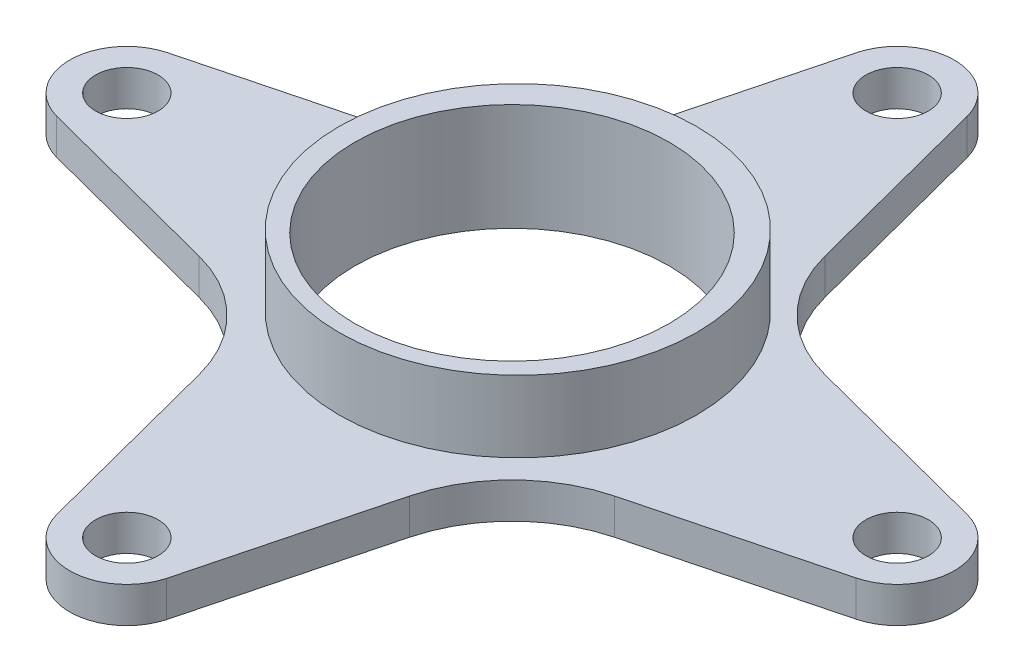
ISO-10303-21;
HEADER;
FILE_DESCRIPTION(('STEP AP214'),'2;1');
FILE_NAME('part.step','',(''),(''),'','','');
FILE_SCHEMA(('AUTOMOTIVE_DESIGN { 1 0 10303 214 1 1 1 1 }'));
ENDSEC;
DATA;
#1=APPLICATION_CONTEXT('core data for automotive mechanical design processes');
#2=APPLICATION_PROTOCOL_DEFINITION('international standard','automotive_design',2000,#1);
#3=PRODUCT_CONTEXT('',#1,'mechanical');
#4=PRODUCT('Part','Part','',(#3));
#5=PRODUCT_RELATED_PRODUCT_CATEGORY('part','',(#4));
#6=PRODUCT_DEFINITION_FORMATION('','',#4);
#7=PRODUCT_DEFINITION_CONTEXT('part definition',#1,'design');
#8=PRODUCT_DEFINITION('design','',#6,#7);
#9=PRODUCT_DEFINITION_SHAPE('','',#8);
#10=(LENGTH_UNIT() NAMED_UNIT(*) SI_UNIT(.MILLI.,.METRE.));
#11=(NAMED_UNIT(*) PLANE_ANGLE_UNIT() SI_UNIT($,.RADIAN.));
#12=(NAMED_UNIT(*) SI_UNIT($,.STERADIAN.) SOLID_ANGLE_UNIT());
#13=UNCERTAINTY_MEASURE_WITH_UNIT(LENGTH_MEASURE(1.E-05),#10,'distance_accuracy_value','');
#14=(GEOMETRIC_REPRESENTATION_CONTEXT(3) GLOBAL_UNCERTAINTY_ASSIGNED_CONTEXT((#13)) GLOBAL_UNIT_ASSIGNED_CONTEXT((#10,
#11,#12)) REPRESENTATION_CONTEXT('',''));
#15=CARTESIAN_POINT('',(0.,0.,0.));
#16=DIRECTION('',(0.,0.,1.));
#17=DIRECTION('',(1.,0.,0.));
#18=AXIS2_PLACEMENT_3D('',#15,#16,#17);
#19=CARTESIAN_POINT('',(0.,6.35,0.));
#20=DIRECTION('',(0.,1.,0.));
#21=DIRECTION('',(0.,0.,1.));
#22=AXIS2_PLACEMENT_3D('',#19,#20,#21);
#23=PLANE('',#22);
#24=CARTESIAN_POINT('',(0.,6.35,68.4523650758932));
#25=DIRECTION('',(0.,1.,0.));
#26=DIRECTION('',(0.,0.,1.));
#27=AXIS2_PLACEMENT_3D('',#24,#25,#26);
#28=CIRCLE('',#27,5.55625000000066);
#29=CARTESIAN_POINT('',(0.,6.35,74.0086150758939));
#30=VERTEX_POINT('',#29);
#31=EDGE_CURVE('E188',#30,#30,#28,.T.);
#32=ORIENTED_EDGE('',*,*,#31,.F.);
#33=EDGE_LOOP('',(#32));
#34=FACE_BOUND('',#33,.T.);
#35=CARTESIAN_POINT('',(68.4523650758936,6.35,-3.33788958924099E-13));
#36=DIRECTION('',(0.,1.,0.));
#37=DIRECTION('',(0.,0.,1.));
#38=AXIS2_PLACEMENT_3D('',#35,#36,#37);
#39=CIRCLE('',#38,5.55625000000064);
#40=CARTESIAN_POINT('',(68.4523650758936,6.35,5.55625000000031));
#41=VERTEX_POINT('',#40);
#42=EDGE_CURVE('E185',#41,#41,#39,.T.);
#43=ORIENTED_EDGE('',*,*,#42,.F.);
#44=EDGE_LOOP('',(#43));
#45=FACE_BOUND('',#44,.T.);
#46=CARTESIAN_POINT('',(0.,6.35,-68.4523650758939));
#47=DIRECTION('',(0.,1.,0.));
#48=DIRECTION('',(0.,0.,1.));
#49=AXIS2_PLACEMENT_3D('',#46,#47,#48);
#50=CIRCLE('',#49,5.55625);
#51=CARTESIAN_POINT('',(0.,6.35,-62.8961150758939));
#52=VERTEX_POINT('',#51);
#53=EDGE_CURVE('E182',#52,#52,#50,.T.);
#54=ORIENTED_EDGE('',*,*,#53,.F.);
#55=EDGE_LOOP('',(#54));
#56=FACE_BOUND('',#55,.T.);
#57=CARTESIAN_POINT('',(-68.4523650758935,6.35,-3.06614624112094E-13));
#58=DIRECTION('',(0.,1.,0.));
#59=DIRECTION('',(0.,0.,1.));
#60=AXIS2_PLACEMENT_3D('',#57,#58,#59);
#61=CIRCLE('',#60,10.1600000000005);
#62=CARTESIAN_POINT('',(-71.0075232026427,6.35,-9.83345142598654));
#63=VERTEX_POINT('',#62);
#64=CARTESIAN_POINT('',(-71.2076831192235,6.35,9.77925469961436));
#65=VERTEX_POINT('',#64);
#66=EDGE_CURVE('E115',#63,#65,#61,.T.);
#67=ORIENTED_EDGE('',*,*,#66,.T.);
#68=DIRECTION('',(-0.967848826896131,0.,-0.251532598833201));
#69=VECTOR('',#68,1.);
#70=CARTESIAN_POINT('',(-6.8859297080687,6.35,26.4957266809896));
#71=LINE('',#70,#69);
#72=CARTESIAN_POINT('',(-36.8926404738746,6.35,18.6973332422493));
#73=VERTEX_POINT('',#72);
#74=EDGE_CURVE('E295',#73,#65,#71,.T.);
#75=ORIENTED_EDGE('',*,*,#74,.F.);
#76=CARTESIAN_POINT('',(-43.2815684842378,6.35,43.280693445411));
#77=DIRECTION('',(0.,1.,0.));
#78=DIRECTION('',(0.,0.,1.));
#79=AXIS2_PLACEMENT_3D('',#76,#77,#78);
#80=CIRCLE('',#79,25.4);
#81=CARTESIAN_POINT('',(-18.6979399192626,6.35,36.8927981285373));
#82=VERTEX_POINT('',#81);
#83=EDGE_CURVE('E280',#82,#73,#80,.T.);
#84=ORIENTED_EDGE('',*,*,#83,.F.);
#85=DIRECTION('',(-0.251491941609204,0.,-0.967859392321856));
#86=VECTOR('',#85,1.);
#87=CARTESIAN_POINT('',(-26.495362052379,6.35,6.88464677726221));
#88=LINE('',#87,#86);
#89=CARTESIAN_POINT('',(-9.83345142598643,6.35,71.0075232026418));
#90=VERTEX_POINT('',#89);
#91=EDGE_CURVE('E294',#90,#82,#88,.T.);
#92=ORIENTED_EDGE('',*,*,#91,.F.);
#93=CARTESIAN_POINT('',(0.,6.35,68.4523650758932));
#94=DIRECTION('',(0.,1.,0.));
#95=DIRECTION('',(0.,0.,1.));
#96=AXIS2_PLACEMENT_3D('',#93,#94,#95);
#97=CIRCLE('',#96,10.1600000000007);
#98=CARTESIAN_POINT('',(9.77925469961468,6.35,71.2076831192232));
#99=VERTEX_POINT('',#98);
#100=EDGE_CURVE('E297',#90,#99,#97,.T.);
#101=ORIENTED_EDGE('',*,*,#100,.T.);
#102=DIRECTION('',(-0.251532598833201,0.,0.967848826896131));
#103=VECTOR('',#102,1.);
#104=CARTESIAN_POINT('',(26.4957266809898,6.35,6.88592970806876));
#105=LINE('',#104,#103);
#106=CARTESIAN_POINT('',(18.6973332422496,6.35,36.8926404738743));
#107=VERTEX_POINT('',#106);
#108=EDGE_CURVE('E303',#107,#99,#105,.T.);
#109=ORIENTED_EDGE('',*,*,#108,.F.);
#110=CARTESIAN_POINT('',(43.2806934454113,6.35,43.2815684842375));
#111=DIRECTION('',(0.,1.,0.));
#112=DIRECTION('',(0.,0.,1.));
#113=AXIS2_PLACEMENT_3D('',#110,#111,#112);
#114=CIRCLE('',#113,25.4);
#115=CARTESIAN_POINT('',(36.8927981285376,6.35,18.6979399192623));
#116=VERTEX_POINT('',#115);
#117=EDGE_CURVE('E306',#116,#107,#114,.T.);
#118=ORIENTED_EDGE('',*,*,#117,.F.);
#119=DIRECTION('',(-0.967859392321856,0.,0.251491941609204));
#120=VECTOR('',#119,1.);
#121=CARTESIAN_POINT('',(6.88464677726216,6.35,26.4953620523788));
#122=LINE('',#121,#120);
#123=CARTESIAN_POINT('',(71.0075232026421,6.35,9.83345142598611));
#124=VERTEX_POINT('',#123);
#125=EDGE_CURVE('E309',#124,#116,#122,.T.);
#126=ORIENTED_EDGE('',*,*,#125,.F.);
#127=CARTESIAN_POINT('',(68.4523650758936,6.35,-3.33788958924099E-13));
#128=DIRECTION('',(0.,1.,0.));
#129=DIRECTION('',(0.,0.,1.));
#130=AXIS2_PLACEMENT_3D('',#127,#128,#129);
#131=CIRCLE('',#130,10.1600000000007);
#132=CARTESIAN_POINT('',(71.2076831192235,6.35,-9.77925469961501));
#133=VERTEX_POINT('',#132);
#134=EDGE_CURVE('E312',#124,#133,#131,.T.);
#135=ORIENTED_EDGE('',*,*,#134,.T.);
#136=DIRECTION('',(0.967848826896131,0.,0.251532598833201));
#137=VECTOR('',#136,1.);
#138=CARTESIAN_POINT('',(6.88592970806886,6.35,-26.4957266809902));
#139=LINE('',#138,#137);
#140=CARTESIAN_POINT('',(36.8926404738746,6.35,-18.6973332422499));
#141=VERTEX_POINT('',#140);
#142=EDGE_CURVE('E314',#141,#133,#139,.T.);
#143=ORIENTED_EDGE('',*,*,#142,.F.);
#144=CARTESIAN_POINT('',(43.2815684842378,6.35,-43.2806934454116));
#145=DIRECTION('',(0.,1.,0.));
#146=DIRECTION('',(0.,0.,1.));
#147=AXIS2_PLACEMENT_3D('',#144,#145,#146);
#148=CIRCLE('',#147,25.4);
#149=CARTESIAN_POINT('',(18.6979399192626,6.35,-36.892798128538));
#150=VERTEX_POINT('',#149);
#151=EDGE_CURVE('E317',#150,#141,#148,.T.);
#152=ORIENTED_EDGE('',*,*,#151,.F.);
#153=DIRECTION('',(0.251491941609204,0.,0.967859392321856));
#154=VECTOR('',#153,1.);
#155=CARTESIAN_POINT('',(26.4953620523792,6.35,-6.88464677726225));
#156=LINE('',#155,#154);
#157=CARTESIAN_POINT('',(9.83345142598613,6.35,-71.0075232026424));
#158=VERTEX_POINT('',#157);
#159=EDGE_CURVE('E177',#158,#150,#156,.T.);
#160=ORIENTED_EDGE('',*,*,#159,.F.);
#161=CARTESIAN_POINT('',(0.,6.35,-68.4523650758939));
#162=DIRECTION('',(0.,1.,0.));
#163=DIRECTION('',(0.,0.,1.));
#164=AXIS2_PLACEMENT_3D('',#161,#162,#163);
#165=CIRCLE('',#164,10.16);
#166=CARTESIAN_POINT('',(-9.77925469961467,6.35,-71.2076831192238));
#167=VERTEX_POINT('',#166);
#168=EDGE_CURVE('E174',#158,#167,#165,.T.);
#169=ORIENTED_EDGE('',*,*,#168,.T.);
#170=DIRECTION('',(0.251532598833201,0.,-0.96784882689613));
#171=VECTOR('',#170,1.);
#172=CARTESIAN_POINT('',(-26.49572668099,6.35,-6.88592970806881));
#173=LINE('',#172,#171);
#174=CARTESIAN_POINT('',(-18.6973332422496,6.35,-36.8926404738749));
#175=VERTEX_POINT('',#174);
#176=EDGE_CURVE('E160',#175,#167,#173,.T.);
#177=ORIENTED_EDGE('',*,*,#176,.F.);
#178=CARTESIAN_POINT('',(-43.2806934454113,6.35,-43.2815684842381));
#179=DIRECTION('',(0.,1.,0.));
#180=DIRECTION('',(0.,0.,1.));
#181=AXIS2_PLACEMENT_3D('',#178,#179,#180);
#182=CIRCLE('',#181,25.4);
#183=CARTESIAN_POINT('',(-36.8927981285376,6.35,-18.6979399192629));
#184=VERTEX_POINT('',#183);
#185=EDGE_CURVE('E167',#175,#184,#182,.F.);
#186=ORIENTED_EDGE('',*,*,#185,.T.);
#187=DIRECTION('',(0.967859392321856,0.,-0.251491941609204));
#188=VECTOR('',#187,1.);
#189=CARTESIAN_POINT('',(-6.8846467772623,6.35,-26.4953620523794));
#190=LINE('',#189,#188);
#191=EDGE_CURVE('E169',#63,#184,#190,.T.);
#192=ORIENTED_EDGE('',*,*,#191,.F.);
#193=EDGE_LOOP('',(#67,#75,#84,#92,#101,#109,#118,#126,#135,#143,#152,#160,#169,#177,#186,#192));
#194=FACE_BOUND('',#193,.T.);
#195=CARTESIAN_POINT('',(-68.4523650758935,6.35,-3.06614624112094E-13));
#196=DIRECTION('',(0.,1.,0.));
#197=DIRECTION('',(0.,0.,1.));
#198=AXIS2_PLACEMENT_3D('',#195,#196,#197);
#199=CIRCLE('',#198,5.55625000000049);
#200=CARTESIAN_POINT('',(-68.4523650758935,6.35,5.55625000000018));
#201=VERTEX_POINT('',#200);
#202=EDGE_CURVE('E251',#201,#201,#199,.T.);
#203=ORIENTED_EDGE('',*,*,#202,.F.);
#204=EDGE_LOOP('',(#203));
#205=FACE_BOUND('',#204,.T.);
#206=CARTESIAN_POINT('',(0.,6.35,-1.03843088413669));
#207=DIRECTION('',(0.,1.,0.));
#208=DIRECTION('',(0.,0.,1.));
#209=AXIS2_PLACEMENT_3D('',#206,#207,#208);
#210=CIRCLE('',#209,31.75);
#211=CARTESIAN_POINT('',(0.,6.35,30.7115691158633));
#212=VERTEX_POINT('',#211);
#213=EDGE_CURVE('E609',#212,#212,#210,.T.);
#214=ORIENTED_EDGE('',*,*,#213,.F.);
#215=EDGE_LOOP('',(#214));
#216=FACE_BOUND('',#215,.T.);
#217=ADVANCED_FACE('F36',(#34,#45,#56,#194,#205,#216),#23,.T.);
#218=CARTESIAN_POINT('',(-68.4523650758935,6.35,-3.06614624112094E-13));
#219=DIRECTION('',(0.,-1.,0.));
#220=DIRECTION('',(0.,0.,-1.));
#221=AXIS2_PLACEMENT_3D('',#218,#219,#220);
#222=CYLINDRICAL_SURFACE('',#221,10.1600000000005);
#223=CARTESIAN_POINT('',(-68.4523650758935,0.,-3.06614624112094E-13));
#224=DIRECTION('',(0.,1.,0.));
#225=DIRECTION('',(0.,0.,1.));
#226=AXIS2_PLACEMENT_3D('',#223,#224,#225);
#227=CIRCLE('',#226,10.1600000000005);
#228=CARTESIAN_POINT('',(-71.0075232026427,0.,-9.83345142598654));
#229=VERTEX_POINT('',#228);
#230=CARTESIAN_POINT('',(-71.2076831192235,0.,9.77925469961436));
#231=VERTEX_POINT('',#230);
#232=EDGE_CURVE('E194',#229,#231,#227,.T.);
#233=ORIENTED_EDGE('',*,*,#232,.T.);
#234=DIRECTION('',(0.,-1.,0.));
#235=VECTOR('',#234,1.);
#236=CARTESIAN_POINT('',(-71.2076831192235,6.35,9.77925469961436));
#237=LINE('',#236,#235);
#238=EDGE_CURVE('E11',#65,#231,#237,.T.);
#239=ORIENTED_EDGE('',*,*,#238,.F.);
#240=ORIENTED_EDGE('',*,*,#66,.F.);
#241=DIRECTION('',(0.,-1.,0.));
#242=VECTOR('',#241,1.);
#243=CARTESIAN_POINT('',(-71.0075232026427,6.35,-9.83345142598654));
#244=LINE('',#243,#242);
#245=EDGE_CURVE('E53',#63,#229,#244,.T.);
#246=ORIENTED_EDGE('',*,*,#245,.T.);
#247=EDGE_LOOP('',(#233,#239,#240,#246));
#248=FACE_BOUND('',#247,.T.);
#249=ADVANCED_FACE('F341',(#248),#222,.T.);
#250=CARTESIAN_POINT('',(-6.8859297080687,6.35,26.4957266809896));
#251=DIRECTION('',(-0.251532598833201,0.,0.96784882689613));
#252=DIRECTION('',(0.967848826896131,0.,0.251532598833201));
#253=AXIS2_PLACEMENT_3D('',#250,#251,#252);
#254=PLANE('',#253);
#255=DIRECTION('',(-0.967848826896131,0.,-0.251532598833201));
#256=VECTOR('',#255,1.);
#257=CARTESIAN_POINT('',(-6.8859297080687,0.,26.4957266809896));
#258=LINE('',#257,#256);
#259=CARTESIAN_POINT('',(-36.8926404738746,0.,18.6973332422493));
#260=VERTEX_POINT('',#259);
#261=EDGE_CURVE('E197',#260,#231,#258,.T.);
#262=ORIENTED_EDGE('',*,*,#261,.F.);
#263=DIRECTION('',(0.,-1.,0.));
#264=VECTOR('',#263,1.);
#265=CARTESIAN_POINT('',(-36.8926404738746,6.35,18.6973332422493));
#266=LINE('',#265,#264);
#267=EDGE_CURVE('E45',#73,#260,#266,.T.);
#268=ORIENTED_EDGE('',*,*,#267,.F.);
#269=ORIENTED_EDGE('',*,*,#74,.T.);
#270=ORIENTED_EDGE('',*,*,#238,.T.);
#271=EDGE_LOOP('',(#262,#268,#269,#270));
#272=FACE_BOUND('',#271,.T.);
#273=ADVANCED_FACE('F283',(#272),#254,.T.);
#274=CARTESIAN_POINT('',(-43.2815684842378,6.35,43.280693445411));
#275=DIRECTION('',(0.,-1.,0.));
#276=DIRECTION('',(0.,0.,-1.));
#277=AXIS2_PLACEMENT_3D('',#274,#275,#276);
#278=CYLINDRICAL_SURFACE('',#277,25.4);
#279=CARTESIAN_POINT('',(-43.2815684842378,0.,43.280693445411));
#280=DIRECTION('',(0.,1.,0.));
#281=DIRECTION('',(0.,0.,1.));
#282=AXIS2_PLACEMENT_3D('',#279,#280,#281);
#283=CIRCLE('',#282,25.4);
#284=CARTESIAN_POINT('',(-18.6979399192626,0.,36.8927981285373));
#285=VERTEX_POINT('',#284);
#286=EDGE_CURVE('E200',#285,#260,#283,.T.);
#287=ORIENTED_EDGE('',*,*,#286,.F.);
#288=DIRECTION('',(0.,-1.,0.));
#289=VECTOR('',#288,1.);
#290=CARTESIAN_POINT('',(-18.6979399192626,6.35,36.8927981285373));
#291=LINE('',#290,#289);
#292=EDGE_CURVE('E273',#82,#285,#291,.T.);
#293=ORIENTED_EDGE('',*,*,#292,.F.);
#294=ORIENTED_EDGE('',*,*,#83,.T.);
#295=ORIENTED_EDGE('',*,*,#267,.T.);
#296=EDGE_LOOP('',(#287,#293,#294,#295));
#297=FACE_BOUND('',#296,.T.);
#298=ADVANCED_FACE('F278',(#297),#278,.F.);
#299=CARTESIAN_POINT('',(-26.495362052379,6.35,6.88464677726221));
#300=DIRECTION('',(-0.967859392321856,0.,0.251491941609204));
#301=DIRECTION('',(0.251491941609204,0.,0.967859392321856));
#302=AXIS2_PLACEMENT_3D('',#299,#300,#301);
#303=PLANE('',#302);
#304=DIRECTION('',(-0.251491941609204,0.,-0.967859392321856));
#305=VECTOR('',#304,1.);
#306=CARTESIAN_POINT('',(-26.495362052379,0.,6.88464677726221));
#307=LINE('',#306,#305);
#308=CARTESIAN_POINT('',(-9.83345142598643,0.,71.0075232026418));
#309=VERTEX_POINT('',#308);
#310=EDGE_CURVE('E203',#309,#285,#307,.T.);
#311=ORIENTED_EDGE('',*,*,#310,.F.);
#312=DIRECTION('',(0.,-1.,0.));
#313=VECTOR('',#312,1.);
#314=CARTESIAN_POINT('',(-9.83345142598643,6.35,71.0075232026418));
#315=LINE('',#314,#313);
#316=EDGE_CURVE('E271',#90,#309,#315,.T.);
#317=ORIENTED_EDGE('',*,*,#316,.F.);
#318=ORIENTED_EDGE('',*,*,#91,.T.);
#319=ORIENTED_EDGE('',*,*,#292,.T.);
#320=EDGE_LOOP('',(#311,#317,#318,#319));
#321=FACE_BOUND('',#320,.T.);
#322=ADVANCED_FACE('F290',(#321),#303,.T.);
#323=CARTESIAN_POINT('',(0.,6.35,68.4523650758932));
#324=DIRECTION('',(0.,-1.,0.));
#325=DIRECTION('',(0.,0.,-1.));
#326=AXIS2_PLACEMENT_3D('',#323,#324,#325);
#327=CYLINDRICAL_SURFACE('',#326,10.1600000000007);
#328=CARTESIAN_POINT('',(0.,0.,68.4523650758932));
#329=DIRECTION('',(0.,1.,0.));
#330=DIRECTION('',(0.,0.,1.));
#331=AXIS2_PLACEMENT_3D('',#328,#329,#330);
#332=CIRCLE('',#331,10.1600000000007);
#333=CARTESIAN_POINT('',(9.77925469961468,0.,71.2076831192232));
#334=VERTEX_POINT('',#333);
#335=EDGE_CURVE('E206',#309,#334,#332,.T.);
#336=ORIENTED_EDGE('',*,*,#335,.T.);
#337=DIRECTION('',(0.,-1.,0.));
#338=VECTOR('',#337,1.);
#339=CARTESIAN_POINT('',(9.77925469961468,6.35,71.2076831192232));
#340=LINE('',#339,#338);
#341=EDGE_CURVE('E269',#99,#334,#340,.T.);
#342=ORIENTED_EDGE('',*,*,#341,.F.);
#343=ORIENTED_EDGE('',*,*,#100,.F.);
#344=ORIENTED_EDGE('',*,*,#316,.T.);
#345=EDGE_LOOP('',(#336,#342,#343,#344));
#346=FACE_BOUND('',#345,.T.);
#347=ADVANCED_FACE('F545',(#346),#327,.T.);
#348=CARTESIAN_POINT('',(26.4957266809898,6.35,6.88592970806876));
#349=DIRECTION('',(0.96784882689613,0.,0.251532598833201));
#350=DIRECTION('',(0.251532598833201,0.,-0.967848826896131));
#351=AXIS2_PLACEMENT_3D('',#348,#349,#350);
#352=PLANE('',#351);
#353=DIRECTION('',(-0.251532598833201,0.,0.967848826896131));
#354=VECTOR('',#353,1.);
#355=CARTESIAN_POINT('',(26.4957266809898,0.,6.88592970806876));
#356=LINE('',#355,#354);
#357=CARTESIAN_POINT('',(18.6973332422496,0.,36.8926404738743));
#358=VERTEX_POINT('',#357);
#359=EDGE_CURVE('E209',#358,#334,#356,.T.);
#360=ORIENTED_EDGE('',*,*,#359,.F.);
#361=DIRECTION('',(0.,-1.,0.));
#362=VECTOR('',#361,1.);
#363=CARTESIAN_POINT('',(18.6973332422496,6.35,36.8926404738743));
#364=LINE('',#363,#362);
#365=EDGE_CURVE('E267',#107,#358,#364,.T.);
#366=ORIENTED_EDGE('',*,*,#365,.F.);
#367=ORIENTED_EDGE('',*,*,#108,.T.);
#368=ORIENTED_EDGE('',*,*,#341,.T.);
#369=EDGE_LOOP('',(#360,#366,#367,#368));
#370=FACE_BOUND('',#369,.T.);
#371=ADVANCED_FACE('F536',(#370),#352,.T.);
#372=CARTESIAN_POINT('',(43.2806934454113,6.35,43.2815684842375));
#373=DIRECTION('',(0.,-1.,0.));
#374=DIRECTION('',(0.,0.,-1.));
#375=AXIS2_PLACEMENT_3D('',#372,#373,#374);
#376=CYLINDRICAL_SURFACE('',#375,25.4);
#377=CARTESIAN_POINT('',(43.2806934454113,0.,43.2815684842375));
#378=DIRECTION('',(0.,1.,0.));
#379=DIRECTION('',(0.,0.,1.));
#380=AXIS2_PLACEMENT_3D('',#377,#378,#379);
#381=CIRCLE('',#380,25.4);
#382=CARTESIAN_POINT('',(36.8927981285376,0.,18.6979399192623));
#383=VERTEX_POINT('',#382);
#384=EDGE_CURVE('E212',#383,#358,#381,.T.);
#385=ORIENTED_EDGE('',*,*,#384,.F.);
#386=DIRECTION('',(0.,-1.,0.));
#387=VECTOR('',#386,1.);
#388=CARTESIAN_POINT('',(36.8927981285376,6.35,18.6979399192623));
#389=LINE('',#388,#387);
#390=EDGE_CURVE('E265',#116,#383,#389,.T.);
#391=ORIENTED_EDGE('',*,*,#390,.F.);
#392=ORIENTED_EDGE('',*,*,#117,.T.);
#393=ORIENTED_EDGE('',*,*,#365,.T.);
#394=EDGE_LOOP('',(#385,#391,#392,#393));
#395=FACE_BOUND('',#394,.T.);
#396=ADVANCED_FACE('F527',(#395),#376,.F.);
#397=CARTESIAN_POINT('',(6.88464677726216,6.35,26.4953620523788));
#398=DIRECTION('',(0.251491941609204,0.,0.967859392321856));
#399=DIRECTION('',(0.967859392321856,0.,-0.251491941609204));
#400=AXIS2_PLACEMENT_3D('',#397,#398,#399);
#401=PLANE('',#400);
#402=DIRECTION('',(-0.967859392321856,0.,0.251491941609204));
#403=VECTOR('',#402,1.);
#404=CARTESIAN_POINT('',(6.88464677726216,0.,26.4953620523788));
#405=LINE('',#404,#403);
#406=CARTESIAN_POINT('',(71.0075232026421,0.,9.83345142598611));
#407=VERTEX_POINT('',#406);
#408=EDGE_CURVE('E215',#407,#383,#405,.T.);
#409=ORIENTED_EDGE('',*,*,#408,.F.);
#410=DIRECTION('',(0.,-1.,0.));
#411=VECTOR('',#410,1.);
#412=CARTESIAN_POINT('',(71.0075232026421,6.35,9.83345142598611));
#413=LINE('',#412,#411);
#414=EDGE_CURVE('E263',#124,#407,#413,.T.);
#415=ORIENTED_EDGE('',*,*,#414,.F.);
#416=ORIENTED_EDGE('',*,*,#125,.T.);
#417=ORIENTED_EDGE('',*,*,#390,.T.);
#418=EDGE_LOOP('',(#409,#415,#416,#417));
#419=FACE_BOUND('',#418,.T.);
#420=ADVANCED_FACE('F518',(#419),#401,.T.);
#421=CARTESIAN_POINT('',(68.4523650758936,6.35,-3.33788958924099E-13));
#422=DIRECTION('',(0.,-1.,0.));
#423=DIRECTION('',(0.,0.,-1.));
#424=AXIS2_PLACEMENT_3D('',#421,#422,#423);
#425=CYLINDRICAL_SURFACE('',#424,10.1600000000007);
#426=CARTESIAN_POINT('',(68.4523650758936,0.,-3.33788958924099E-13));
#427=DIRECTION('',(0.,1.,0.));
#428=DIRECTION('',(0.,0.,1.));
#429=AXIS2_PLACEMENT_3D('',#426,#427,#428);
#430=CIRCLE('',#429,10.1600000000007);
#431=CARTESIAN_POINT('',(71.2076831192235,0.,-9.77925469961501));
#432=VERTEX_POINT('',#431);
#433=EDGE_CURVE('E218',#407,#432,#430,.T.);
#434=ORIENTED_EDGE('',*,*,#433,.T.);
#435=DIRECTION('',(0.,-1.,0.));
#436=VECTOR('',#435,1.);
#437=CARTESIAN_POINT('',(71.2076831192235,6.35,-9.77925469961501));
#438=LINE('',#437,#436);
#439=EDGE_CURVE('E261',#133,#432,#438,.T.);
#440=ORIENTED_EDGE('',*,*,#439,.F.);
#441=ORIENTED_EDGE('',*,*,#134,.F.);
#442=ORIENTED_EDGE('',*,*,#414,.T.);
#443=EDGE_LOOP('',(#434,#440,#441,#442));
#444=FACE_BOUND('',#443,.T.);
#445=ADVANCED_FACE('F509',(#444),#425,.T.);
#446=CARTESIAN_POINT('',(6.88592970806886,6.35,-26.4957266809902));
#447=DIRECTION('',(0.251532598833201,0.,-0.96784882689613));
#448=DIRECTION('',(-0.967848826896131,0.,-0.251532598833201));
#449=AXIS2_PLACEMENT_3D('',#446,#447,#448);
#450=PLANE('',#449);
#451=DIRECTION('',(0.967848826896131,0.,0.251532598833201));
#452=VECTOR('',#451,1.);
#453=CARTESIAN_POINT('',(6.88592970806886,0.,-26.4957266809902));
#454=LINE('',#453,#452);
#455=CARTESIAN_POINT('',(36.8926404738746,0.,-18.6973332422499));
#456=VERTEX_POINT('',#455);
#457=EDGE_CURVE('E221',#456,#432,#454,.T.);
#458=ORIENTED_EDGE('',*,*,#457,.F.);
#459=DIRECTION('',(0.,-1.,0.));
#460=VECTOR('',#459,1.);
#461=CARTESIAN_POINT('',(36.8926404738746,6.35,-18.6973332422499));
#462=LINE('',#461,#460);
#463=EDGE_CURVE('E259',#141,#456,#462,.T.);
#464=ORIENTED_EDGE('',*,*,#463,.F.);
#465=ORIENTED_EDGE('',*,*,#142,.T.);
#466=ORIENTED_EDGE('',*,*,#439,.T.);
#467=EDGE_LOOP('',(#458,#464,#465,#466));
#468=FACE_BOUND('',#467,.T.);
#469=ADVANCED_FACE('F501',(#468),#450,.T.);
#470=CARTESIAN_POINT('',(43.2815684842378,6.35,-43.2806934454116));
#471=DIRECTION('',(0.,-1.,0.));
#472=DIRECTION('',(0.,0.,-1.));
#473=AXIS2_PLACEMENT_3D('',#470,#471,#472);
#474=CYLINDRICAL_SURFACE('',#473,25.4);
#475=CARTESIAN_POINT('',(43.2815684842378,0.,-43.2806934454116));
#476=DIRECTION('',(0.,1.,0.));
#477=DIRECTION('',(0.,0.,1.));
#478=AXIS2_PLACEMENT_3D('',#475,#476,#477);
#479=CIRCLE('',#478,25.4);
#480=CARTESIAN_POINT('',(18.6979399192626,0.,-36.892798128538));
#481=VERTEX_POINT('',#480);
#482=EDGE_CURVE('E224',#481,#456,#479,.T.);
#483=ORIENTED_EDGE('',*,*,#482,.F.);
#484=DIRECTION('',(0.,-1.,0.));
#485=VECTOR('',#484,1.);
#486=CARTESIAN_POINT('',(18.6979399192626,6.35,-36.892798128538));
#487=LINE('',#486,#485);
#488=EDGE_CURVE('E257',#150,#481,#487,.T.);
#489=ORIENTED_EDGE('',*,*,#488,.F.);
#490=ORIENTED_EDGE('',*,*,#151,.T.);
#491=ORIENTED_EDGE('',*,*,#463,.T.);
#492=EDGE_LOOP('',(#483,#489,#490,#491));
#493=FACE_BOUND('',#492,.T.);
#494=ADVANCED_FACE('F327',(#493),#474,.F.);
#495=CARTESIAN_POINT('',(26.4953620523792,6.35,-6.88464677726225));
#496=DIRECTION('',(0.967859392321856,0.,-0.251491941609204));
#497=DIRECTION('',(-0.251491941609204,0.,-0.967859392321856));
#498=AXIS2_PLACEMENT_3D('',#495,#496,#497);
#499=PLANE('',#498);
#500=DIRECTION('',(0.251491941609204,0.,0.967859392321856));
#501=VECTOR('',#500,1.);
#502=CARTESIAN_POINT('',(26.4953620523792,0.,-6.88464677726225));
#503=LINE('',#502,#501);
#504=CARTESIAN_POINT('',(9.83345142598613,0.,-71.0075232026424));
#505=VERTEX_POINT('',#504);
#506=EDGE_CURVE('E227',#505,#481,#503,.T.);
#507=ORIENTED_EDGE('',*,*,#506,.F.);
#508=DIRECTION('',(0.,-1.,0.));
#509=VECTOR('',#508,1.);
#510=CARTESIAN_POINT('',(9.83345142598613,6.35,-71.0075232026424));
#511=LINE('',#510,#509);
#512=EDGE_CURVE('E255',#158,#505,#511,.T.);
#513=ORIENTED_EDGE('',*,*,#512,.F.);
#514=ORIENTED_EDGE('',*,*,#159,.T.);
#515=ORIENTED_EDGE('',*,*,#488,.T.);
#516=EDGE_LOOP('',(#507,#513,#514,#515));
#517=FACE_BOUND('',#516,.T.);
#518=ADVANCED_FACE('F322',(#517),#499,.T.);
#519=CARTESIAN_POINT('',(0.,6.35,-68.4523650758939));
#520=DIRECTION('',(0.,-1.,0.));
#521=DIRECTION('',(0.,0.,-1.));
#522=AXIS2_PLACEMENT_3D('',#519,#520,#521);
#523=CYLINDRICAL_SURFACE('',#522,10.16);
#524=CARTESIAN_POINT('',(0.,0.,-68.4523650758939));
#525=DIRECTION('',(0.,1.,0.));
#526=DIRECTION('',(0.,0.,1.));
#527=AXIS2_PLACEMENT_3D('',#524,#525,#526);
#528=CIRCLE('',#527,10.16);
#529=CARTESIAN_POINT('',(-9.77925469961467,0.,-71.2076831192238));
#530=VERTEX_POINT('',#529);
#531=EDGE_CURVE('E230',#505,#530,#528,.T.);
#532=ORIENTED_EDGE('',*,*,#531,.T.);
#533=DIRECTION('',(0.,-1.,0.));
#534=VECTOR('',#533,1.);
#535=CARTESIAN_POINT('',(-9.77925469961467,6.35,-71.2076831192238));
#536=LINE('',#535,#534);
#537=EDGE_CURVE('E165',#167,#530,#536,.T.);
#538=ORIENTED_EDGE('',*,*,#537,.F.);
#539=ORIENTED_EDGE('',*,*,#168,.F.);
#540=ORIENTED_EDGE('',*,*,#512,.T.);
#541=EDGE_LOOP('',(#532,#538,#539,#540));
#542=FACE_BOUND('',#541,.T.);
#543=ADVANCED_FACE('F331',(#542),#523,.T.);
#544=CARTESIAN_POINT('',(-26.49572668099,6.35,-6.88592970806881));
#545=DIRECTION('',(-0.96784882689613,0.,-0.251532598833201));
#546=DIRECTION('',(-0.251532598833201,0.,0.96784882689613));
#547=AXIS2_PLACEMENT_3D('',#544,#545,#546);
#548=PLANE('',#547);
#549=DIRECTION('',(0.251532598833201,0.,-0.96784882689613));
#550=VECTOR('',#549,1.);
#551=CARTESIAN_POINT('',(-26.49572668099,0.,-6.88592970806881));
#552=LINE('',#551,#550);
#553=CARTESIAN_POINT('',(-18.6973332422496,0.,-36.8926404738749));
#554=VERTEX_POINT('',#553);
#555=EDGE_CURVE('E162',#554,#530,#552,.T.);
#556=ORIENTED_EDGE('',*,*,#555,.F.);
#557=DIRECTION('',(0.,-1.,0.));
#558=VECTOR('',#557,1.);
#559=CARTESIAN_POINT('',(-18.6973332422496,6.35,-36.8926404738749));
#560=LINE('',#559,#558);
#561=EDGE_CURVE('E156',#175,#554,#560,.T.);
#562=ORIENTED_EDGE('',*,*,#561,.F.);
#563=ORIENTED_EDGE('',*,*,#176,.T.);
#564=ORIENTED_EDGE('',*,*,#537,.T.);
#565=EDGE_LOOP('',(#556,#562,#563,#564));
#566=FACE_BOUND('',#565,.T.);
#567=ADVANCED_FACE('F158',(#566),#548,.T.);
#568=CARTESIAN_POINT('',(-43.2806934454113,6.35,-43.2815684842381));
#569=DIRECTION('',(0.,-1.,0.));
#570=DIRECTION('',(0.,0.,-1.));
#571=AXIS2_PLACEMENT_3D('',#568,#569,#570);
#572=CYLINDRICAL_SURFACE('',#571,25.4);
#573=CARTESIAN_POINT('',(-43.2806934454113,0.,-43.2815684842381));
#574=DIRECTION('',(0.,1.,0.));
#575=DIRECTION('',(0.,0.,1.));
#576=AXIS2_PLACEMENT_3D('',#573,#574,#575);
#577=CIRCLE('',#576,25.4);
#578=CARTESIAN_POINT('',(-36.8927981285376,0.,-18.6979399192629));
#579=VERTEX_POINT('',#578);
#580=EDGE_CURVE('E234',#554,#579,#577,.F.);
#581=ORIENTED_EDGE('',*,*,#580,.T.);
#582=DIRECTION('',(0.,-1.,0.));
#583=VECTOR('',#582,1.);
#584=CARTESIAN_POINT('',(-36.8927981285376,6.35,-18.6979399192629));
#585=LINE('',#584,#583);
#586=EDGE_CURVE('E103',#184,#579,#585,.T.);
#587=ORIENTED_EDGE('',*,*,#586,.F.);
#588=ORIENTED_EDGE('',*,*,#185,.F.);
#589=ORIENTED_EDGE('',*,*,#561,.T.);
#590=EDGE_LOOP('',(#581,#587,#588,#589));
#591=FACE_BOUND('',#590,.T.);
#592=ADVANCED_FACE('F168',(#591),#572,.F.);
#593=CARTESIAN_POINT('',(0.,6.35,68.4523650758932));
#594=DIRECTION('',(0.,-1.,0.));
#595=DIRECTION('',(0.,0.,-1.));
#596=AXIS2_PLACEMENT_3D('',#593,#594,#595);
#597=CYLINDRICAL_SURFACE('',#596,5.55625000000066);
#598=ORIENTED_EDGE('',*,*,#31,.T.);
#599=EDGE_LOOP('',(#598));
#600=FACE_BOUND('',#599,.T.);
#601=CARTESIAN_POINT('',(0.,0.,68.4523650758932));
#602=DIRECTION('',(0.,1.,0.));
#603=DIRECTION('',(0.,0.,1.));
#604=AXIS2_PLACEMENT_3D('',#601,#602,#603);
#605=CIRCLE('',#604,5.55625000000066);
#606=CARTESIAN_POINT('',(0.,0.,74.0086150758939));
#607=VERTEX_POINT('',#606);
#608=EDGE_CURVE('E245',#607,#607,#605,.T.);
#609=ORIENTED_EDGE('',*,*,#608,.F.);
#610=EDGE_LOOP('',(#609));
#611=FACE_BOUND('',#610,.T.);
#612=ADVANCED_FACE('F361',(#600,#611),#597,.F.);
#613=CARTESIAN_POINT('',(68.4523650758936,6.35,-3.33788958924099E-13));
#614=DIRECTION('',(0.,-1.,0.));
#615=DIRECTION('',(0.,0.,-1.));
#616=AXIS2_PLACEMENT_3D('',#613,#614,#615);
#617=CYLINDRICAL_SURFACE('',#616,5.55625000000064);
#618=ORIENTED_EDGE('',*,*,#42,.T.);
#619=EDGE_LOOP('',(#618));
#620=FACE_BOUND('',#619,.T.);
#621=CARTESIAN_POINT('',(68.4523650758936,0.,-3.33788958924099E-13));
#622=DIRECTION('',(0.,1.,0.));
#623=DIRECTION('',(0.,0.,1.));
#624=AXIS2_PLACEMENT_3D('',#621,#622,#623);
#625=CIRCLE('',#624,5.55625000000064);
#626=CARTESIAN_POINT('',(68.4523650758936,0.,5.55625000000031));
#627=VERTEX_POINT('',#626);
#628=EDGE_CURVE('E242',#627,#627,#625,.T.);
#629=ORIENTED_EDGE('',*,*,#628,.F.);
#630=EDGE_LOOP('',(#629));
#631=FACE_BOUND('',#630,.T.);
#632=ADVANCED_FACE('F364',(#620,#631),#617,.F.);
#633=CARTESIAN_POINT('',(0.,6.35,-68.4523650758939));
#634=DIRECTION('',(0.,-1.,0.));
#635=DIRECTION('',(0.,0.,-1.));
#636=AXIS2_PLACEMENT_3D('',#633,#634,#635);
#637=CYLINDRICAL_SURFACE('',#636,5.55625);
#638=ORIENTED_EDGE('',*,*,#53,.T.);
#639=EDGE_LOOP('',(#638));
#640=FACE_BOUND('',#639,.T.);
#641=CARTESIAN_POINT('',(0.,0.,-68.4523650758939));
#642=DIRECTION('',(0.,1.,0.));
#643=DIRECTION('',(0.,0.,1.));
#644=AXIS2_PLACEMENT_3D('',#641,#642,#643);
#645=CIRCLE('',#644,5.55625);
#646=CARTESIAN_POINT('',(0.,0.,-62.8961150758939));
#647=VERTEX_POINT('',#646);
#648=EDGE_CURVE('E239',#647,#647,#645,.T.);
#649=ORIENTED_EDGE('',*,*,#648,.F.);
#650=EDGE_LOOP('',(#649));
#651=FACE_BOUND('',#650,.T.);
#652=ADVANCED_FACE('F368',(#640,#651),#637,.F.);
#653=CARTESIAN_POINT('',(-6.8846467772623,6.35,-26.4953620523794));
#654=DIRECTION('',(-0.251491941609204,0.,-0.967859392321856));
#655=DIRECTION('',(-0.967859392321856,0.,0.251491941609204));
#656=AXIS2_PLACEMENT_3D('',#653,#654,#655);
#657=PLANE('',#656);
#658=DIRECTION('',(0.967859392321856,0.,-0.251491941609204));
#659=VECTOR('',#658,1.);
#660=CARTESIAN_POINT('',(-6.8846467772623,0.,-26.4953620523794));
#661=LINE('',#660,#659);
#662=EDGE_CURVE('E236',#229,#579,#661,.T.);
#663=ORIENTED_EDGE('',*,*,#662,.F.);
#664=ORIENTED_EDGE('',*,*,#245,.F.);
#665=ORIENTED_EDGE('',*,*,#191,.T.);
#666=ORIENTED_EDGE('',*,*,#586,.T.);
#667=EDGE_LOOP('',(#663,#664,#665,#666));
#668=FACE_BOUND('',#667,.T.);
#669=ADVANCED_FACE('F372',(#668),#657,.T.);
#670=CARTESIAN_POINT('',(-68.4523650758935,6.35,-3.06614624112094E-13));
#671=DIRECTION('',(0.,-1.,0.));
#672=DIRECTION('',(0.,0.,-1.));
#673=AXIS2_PLACEMENT_3D('',#670,#671,#672);
#674=CYLINDRICAL_SURFACE('',#673,5.55625000000049);
#675=ORIENTED_EDGE('',*,*,#202,.T.);
#676=EDGE_LOOP('',(#675));
#677=FACE_BOUND('',#676,.T.);
#678=CARTESIAN_POINT('',(-68.4523650758935,0.,-3.06614624112094E-13));
#679=DIRECTION('',(0.,1.,0.));
#680=DIRECTION('',(0.,0.,1.));
#681=AXIS2_PLACEMENT_3D('',#678,#679,#680);
#682=CIRCLE('',#681,5.55625000000049);
#683=CARTESIAN_POINT('',(-68.4523650758935,0.,5.55625000000018));
#684=VERTEX_POINT('',#683);
#685=EDGE_CURVE('E191',#684,#684,#682,.T.);
#686=ORIENTED_EDGE('',*,*,#685,.F.);
#687=EDGE_LOOP('',(#686));
#688=FACE_BOUND('',#687,.T.);
#689=ADVANCED_FACE('F38',(#677,#688),#674,.F.);
#690=CARTESIAN_POINT('',(0.,6.35,0.));
#691=DIRECTION('',(0.,-1.,0.));
#692=DIRECTION('',(0.,0.,-1.));
#693=AXIS2_PLACEMENT_3D('',#690,#691,#692);
#694=CYLINDRICAL_SURFACE('',#693,27.94);
#695=CARTESIAN_POINT('',(0.,0.,0.));
#696=DIRECTION('',(0.,1.,0.));
#697=DIRECTION('',(0.,0.,1.));
#698=AXIS2_PLACEMENT_3D('',#695,#696,#697);
#699=CIRCLE('',#698,27.94);
#700=CARTESIAN_POINT('',(0.,0.,27.94));
#701=VERTEX_POINT('',#700);
#702=EDGE_CURVE('E248',#701,#701,#699,.T.);
#703=ORIENTED_EDGE('',*,*,#702,.F.);
#704=EDGE_LOOP('',(#703));
#705=FACE_BOUND('',#704,.T.);
#706=CARTESIAN_POINT('',(0.,19.05,0.));
#707=DIRECTION('',(0.,1.,0.));
#708=DIRECTION('',(0.,0.,1.));
#709=AXIS2_PLACEMENT_3D('',#706,#707,#708);
#710=CIRCLE('',#709,27.94);
#711=CARTESIAN_POINT('',(0.,19.05,27.94));
#712=VERTEX_POINT('',#711);
#713=EDGE_CURVE('E611',#712,#712,#710,.T.);
#714=ORIENTED_EDGE('',*,*,#713,.T.);
#715=EDGE_LOOP('',(#714));
#716=FACE_BOUND('',#715,.T.);
#717=ADVANCED_FACE('F356',(#705,#716),#694,.F.);
#718=CARTESIAN_POINT('',(0.,0.,0.));
#719=DIRECTION('',(0.,1.,0.));
#720=DIRECTION('',(0.,0.,1.));
#721=AXIS2_PLACEMENT_3D('',#718,#719,#720);
#722=PLANE('',#721);
#723=ORIENTED_EDGE('',*,*,#685,.T.);
#724=EDGE_LOOP('',(#723));
#725=FACE_BOUND('',#724,.T.);
#726=ORIENTED_EDGE('',*,*,#232,.F.);
#727=ORIENTED_EDGE('',*,*,#662,.T.);
#728=ORIENTED_EDGE('',*,*,#580,.F.);
#729=ORIENTED_EDGE('',*,*,#555,.T.);
#730=ORIENTED_EDGE('',*,*,#531,.F.);
#731=ORIENTED_EDGE('',*,*,#506,.T.);
#732=ORIENTED_EDGE('',*,*,#482,.T.);
#733=ORIENTED_EDGE('',*,*,#457,.T.);
#734=ORIENTED_EDGE('',*,*,#433,.F.);
#735=ORIENTED_EDGE('',*,*,#408,.T.);
#736=ORIENTED_EDGE('',*,*,#384,.T.);
#737=ORIENTED_EDGE('',*,*,#359,.T.);
#738=ORIENTED_EDGE('',*,*,#335,.F.);
#739=ORIENTED_EDGE('',*,*,#310,.T.);
#740=ORIENTED_EDGE('',*,*,#286,.T.);
#741=ORIENTED_EDGE('',*,*,#261,.T.);
#742=EDGE_LOOP('',(#726,#727,#728,#729,#730,#731,#732,#733,#734,#735,#736,#737,#738,#739,#740,#741));
#743=FACE_BOUND('',#742,.T.);
#744=ORIENTED_EDGE('',*,*,#648,.T.);
#745=EDGE_LOOP('',(#744));
#746=FACE_BOUND('',#745,.T.);
#747=ORIENTED_EDGE('',*,*,#628,.T.);
#748=EDGE_LOOP('',(#747));
#749=FACE_BOUND('',#748,.T.);
#750=ORIENTED_EDGE('',*,*,#608,.T.);
#751=EDGE_LOOP('',(#750));
#752=FACE_BOUND('',#751,.T.);
#753=ORIENTED_EDGE('',*,*,#702,.T.);
#754=EDGE_LOOP('',(#753));
#755=FACE_BOUND('',#754,.T.);
#756=ADVANCED_FACE('F285',(#725,#743,#746,#749,#752,#755),#722,.F.);
#757=CARTESIAN_POINT('',(0.,19.05,-1.03843088413669));
#758=DIRECTION('',(0.,1.,0.));
#759=DIRECTION('',(0.,0.,1.));
#760=AXIS2_PLACEMENT_3D('',#757,#758,#759);
#761=PLANE('',#760);
#762=CARTESIAN_POINT('',(0.,19.05,-1.03843088413669));
#763=DIRECTION('',(0.,1.,0.));
#764=DIRECTION('',(0.,0.,1.));
#765=AXIS2_PLACEMENT_3D('',#762,#763,#764);
#766=CIRCLE('',#765,31.75);
#767=CARTESIAN_POINT('',(0.,19.05,30.7115691158633));
#768=VERTEX_POINT('',#767);
#769=EDGE_CURVE('E195',#768,#768,#766,.T.);
#770=ORIENTED_EDGE('',*,*,#769,.T.);
#771=EDGE_LOOP('',(#770));
#772=FACE_BOUND('',#771,.T.);
#773=ORIENTED_EDGE('',*,*,#713,.F.);
#774=EDGE_LOOP('',(#773));
#775=FACE_BOUND('',#774,.T.);
#776=ADVANCED_FACE('F355',(#772,#775),#761,.T.);
#777=CARTESIAN_POINT('',(0.,19.05,-1.03843088413669));
#778=DIRECTION('',(0.,-1.,0.));
#779=DIRECTION('',(0.,0.,-1.));
#780=AXIS2_PLACEMENT_3D('',#777,#778,#779);
#781=CYLINDRICAL_SURFACE('',#780,31.75);
#782=ORIENTED_EDGE('',*,*,#769,.F.);
#783=EDGE_LOOP('',(#782));
#784=FACE_BOUND('',#783,.T.);
#785=ORIENTED_EDGE('',*,*,#213,.T.);
#786=EDGE_LOOP('',(#785));
#787=FACE_BOUND('',#786,.T.);
#788=ADVANCED_FACE('F351',(#784,#787),#781,.T.);
#789=CLOSED_SHELL('',(#217,#249,#273,#298,#322,#347,#371,#396,#420,#445,#469,#494,#518,#543,
#567,#592,#612,#632,#652,#669,#689,#717,#756,#776,#788));
#790=MANIFOLD_SOLID_BREP('B2',#789);
#791=ADVANCED_BREP_SHAPE_REPRESENTATION('',(#18,#790),#14);
#792=SHAPE_DEFINITION_REPRESENTATION(#9,#791);
ENDSEC;
END-ISO-10303-21;
